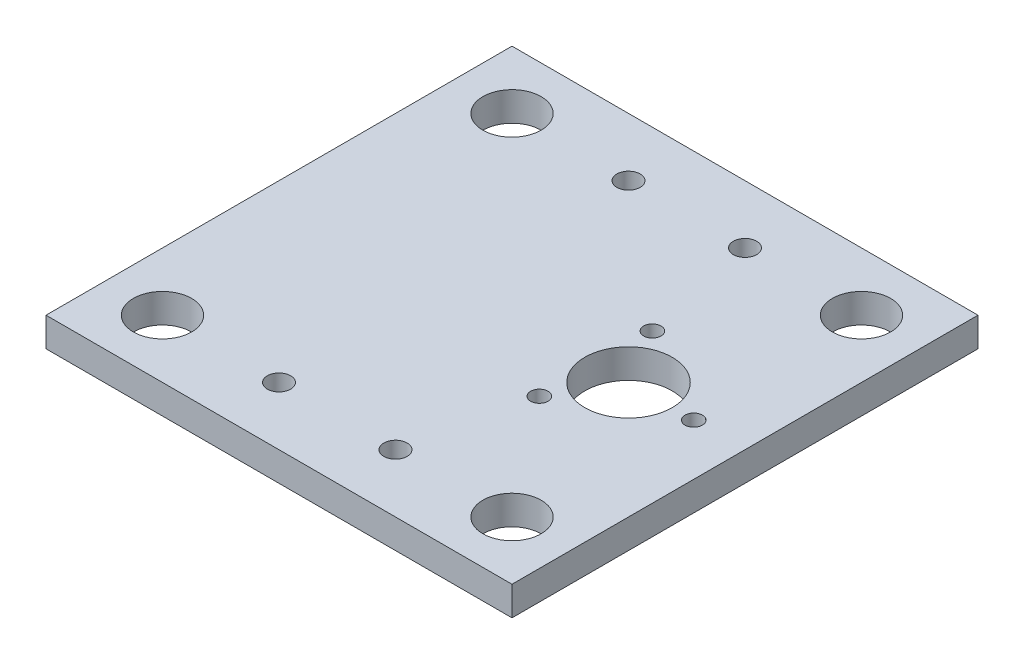
ISO-10303-21;
HEADER;
FILE_DESCRIPTION(('STEP AP214'),'2;1');
FILE_NAME('part.step','',(''),(''),'','','');
FILE_SCHEMA(('AUTOMOTIVE_DESIGN { 1 0 10303 214 1 1 1 1 }'));
ENDSEC;
DATA;
#1=APPLICATION_CONTEXT('core data for automotive mechanical design processes');
#2=APPLICATION_PROTOCOL_DEFINITION('international standard','automotive_design',2000,#1);
#3=PRODUCT_CONTEXT('',#1,'mechanical');
#4=PRODUCT('Part','Part','',(#3));
#5=PRODUCT_RELATED_PRODUCT_CATEGORY('part','',(#4));
#6=PRODUCT_DEFINITION_FORMATION('','',#4);
#7=PRODUCT_DEFINITION_CONTEXT('part definition',#1,'design');
#8=PRODUCT_DEFINITION('design','',#6,#7);
#9=PRODUCT_DEFINITION_SHAPE('','',#8);
#10=(LENGTH_UNIT() NAMED_UNIT(*) SI_UNIT(.MILLI.,.METRE.));
#11=(NAMED_UNIT(*) PLANE_ANGLE_UNIT() SI_UNIT($,.RADIAN.));
#12=(NAMED_UNIT(*) SI_UNIT($,.STERADIAN.) SOLID_ANGLE_UNIT());
#13=UNCERTAINTY_MEASURE_WITH_UNIT(LENGTH_MEASURE(1.E-05),#10,'distance_accuracy_value','');
#14=(GEOMETRIC_REPRESENTATION_CONTEXT(3) GLOBAL_UNCERTAINTY_ASSIGNED_CONTEXT((#13)) GLOBAL_UNIT_ASSIGNED_CONTEXT((#10,
#11,#12)) REPRESENTATION_CONTEXT('',''));
#15=CARTESIAN_POINT('',(0.,0.,0.));
#16=DIRECTION('',(0.,0.,1.));
#17=DIRECTION('',(1.,0.,0.));
#18=AXIS2_PLACEMENT_3D('',#15,#16,#17);
#19=CARTESIAN_POINT('',(0.,0.,0.));
#20=DIRECTION('',(0.,1.,0.));
#21=DIRECTION('',(0.,0.,1.));
#22=AXIS2_PLACEMENT_3D('',#19,#20,#21);
#23=PLANE('',#22);
#24=CARTESIAN_POINT('',(12.7,0.,-38.1));
#25=DIRECTION('',(0.,-1.,0.));
#26=DIRECTION('',(0.,0.,-1.));
#27=AXIS2_PLACEMENT_3D('',#24,#25,#26);
#28=CIRCLE('',#27,2.54);
#29=CARTESIAN_POINT('',(12.7,0.,-40.64));
#30=VERTEX_POINT('',#29);
#31=EDGE_CURVE('E113',#30,#30,#28,.F.);
#32=ORIENTED_EDGE('',*,*,#31,.T.);
#33=EDGE_LOOP('',(#32));
#34=FACE_BOUND('',#33,.T.);
#35=CARTESIAN_POINT('',(-12.7,0.,-38.1));
#36=DIRECTION('',(0.,1.,0.));
#37=DIRECTION('',(0.,0.,1.));
#38=AXIS2_PLACEMENT_3D('',#35,#36,#37);
#39=CIRCLE('',#38,2.54);
#40=CARTESIAN_POINT('',(-12.7,0.,-35.56));
#41=VERTEX_POINT('',#40);
#42=EDGE_CURVE('E117',#41,#41,#39,.T.);
#43=ORIENTED_EDGE('',*,*,#42,.T.);
#44=EDGE_LOOP('',(#43));
#45=FACE_BOUND('',#44,.T.);
#46=CARTESIAN_POINT('',(12.7,0.,38.1));
#47=DIRECTION('',(0.,1.,0.));
#48=DIRECTION('',(0.,0.,1.));
#49=AXIS2_PLACEMENT_3D('',#46,#47,#48);
#50=CIRCLE('',#49,2.54);
#51=CARTESIAN_POINT('',(12.7,0.,40.64));
#52=VERTEX_POINT('',#51);
#53=EDGE_CURVE('E120',#52,#52,#50,.T.);
#54=ORIENTED_EDGE('',*,*,#53,.T.);
#55=EDGE_LOOP('',(#54));
#56=FACE_BOUND('',#55,.T.);
#57=CARTESIAN_POINT('',(-12.7,0.,38.1));
#58=DIRECTION('',(0.,-1.,0.));
#59=DIRECTION('',(0.,0.,-1.));
#60=AXIS2_PLACEMENT_3D('',#57,#58,#59);
#61=CIRCLE('',#60,2.54);
#62=CARTESIAN_POINT('',(-12.7,0.,35.56));
#63=VERTEX_POINT('',#62);
#64=EDGE_CURVE('E123',#63,#63,#61,.F.);
#65=ORIENTED_EDGE('',*,*,#64,.T.);
#66=EDGE_LOOP('',(#65));
#67=FACE_BOUND('',#66,.T.);
#68=CARTESIAN_POINT('',(18.288,0.,12.3183453434299));
#69=DIRECTION('',(0.,1.,0.));
#70=DIRECTION('',(0.,0.,1.));
#71=AXIS2_PLACEMENT_3D('',#68,#69,#70);
#72=CIRCLE('',#71,1.89865);
#73=CARTESIAN_POINT('',(18.288,0.,14.2169953434299));
#74=VERTEX_POINT('',#73);
#75=EDGE_CURVE('E126',#74,#74,#72,.T.);
#76=ORIENTED_EDGE('',*,*,#75,.T.);
#77=EDGE_LOOP('',(#76));
#78=FACE_BOUND('',#77,.T.);
#79=CARTESIAN_POINT('',(18.288,0.,-12.3183453434299));
#80=DIRECTION('',(0.,1.,0.));
#81=DIRECTION('',(0.,0.,1.));
#82=AXIS2_PLACEMENT_3D('',#79,#80,#81);
#83=CIRCLE('',#82,1.89865);
#84=CARTESIAN_POINT('',(18.288,0.,-10.4196953434299));
#85=VERTEX_POINT('',#84);
#86=EDGE_CURVE('E129',#85,#85,#83,.T.);
#87=ORIENTED_EDGE('',*,*,#86,.T.);
#88=EDGE_LOOP('',(#87));
#89=FACE_BOUND('',#88,.T.);
#90=CARTESIAN_POINT('',(39.624,0.,0.));
#91=DIRECTION('',(0.,1.,0.));
#92=DIRECTION('',(0.,0.,1.));
#93=AXIS2_PLACEMENT_3D('',#90,#91,#92);
#94=CIRCLE('',#93,1.89865);
#95=CARTESIAN_POINT('',(39.624,0.,1.89865));
#96=VERTEX_POINT('',#95);
#97=EDGE_CURVE('E132',#96,#96,#94,.T.);
#98=ORIENTED_EDGE('',*,*,#97,.T.);
#99=EDGE_LOOP('',(#98));
#100=FACE_BOUND('',#99,.T.);
#101=CARTESIAN_POINT('',(25.4,0.,0.));
#102=DIRECTION('',(0.,1.,0.));
#103=DIRECTION('',(0.,0.,1.));
#104=AXIS2_PLACEMENT_3D('',#101,#102,#103);
#105=CIRCLE('',#104,9.525);
#106=CARTESIAN_POINT('',(25.4,0.,9.525));
#107=VERTEX_POINT('',#106);
#108=EDGE_CURVE('E135',#107,#107,#105,.T.);
#109=ORIENTED_EDGE('',*,*,#108,.T.);
#110=EDGE_LOOP('',(#109));
#111=FACE_BOUND('',#110,.T.);
#112=CARTESIAN_POINT('',(-38.1,0.,38.1));
#113=DIRECTION('',(0.,1.,0.));
#114=DIRECTION('',(0.,0.,1.));
#115=AXIS2_PLACEMENT_3D('',#112,#113,#114);
#116=CIRCLE('',#115,6.35);
#117=CARTESIAN_POINT('',(-38.1,0.,44.45));
#118=VERTEX_POINT('',#117);
#119=EDGE_CURVE('E138',#118,#118,#116,.T.);
#120=ORIENTED_EDGE('',*,*,#119,.T.);
#121=EDGE_LOOP('',(#120));
#122=FACE_BOUND('',#121,.T.);
#123=CARTESIAN_POINT('',(38.1,0.,38.1));
#124=DIRECTION('',(0.,1.,0.));
#125=DIRECTION('',(0.,0.,1.));
#126=AXIS2_PLACEMENT_3D('',#123,#124,#125);
#127=CIRCLE('',#126,6.35);
#128=CARTESIAN_POINT('',(38.1,0.,44.45));
#129=VERTEX_POINT('',#128);
#130=EDGE_CURVE('E141',#129,#129,#127,.T.);
#131=ORIENTED_EDGE('',*,*,#130,.T.);
#132=EDGE_LOOP('',(#131));
#133=FACE_BOUND('',#132,.T.);
#134=CARTESIAN_POINT('',(38.1,0.,-38.1));
#135=DIRECTION('',(0.,1.,0.));
#136=DIRECTION('',(0.,0.,1.));
#137=AXIS2_PLACEMENT_3D('',#134,#135,#136);
#138=CIRCLE('',#137,6.35);
#139=CARTESIAN_POINT('',(38.1,0.,-31.75));
#140=VERTEX_POINT('',#139);
#141=EDGE_CURVE('E143',#140,#140,#138,.T.);
#142=ORIENTED_EDGE('',*,*,#141,.T.);
#143=EDGE_LOOP('',(#142));
#144=FACE_BOUND('',#143,.T.);
#145=CARTESIAN_POINT('',(-38.1,0.,-38.1));
#146=DIRECTION('',(0.,1.,0.));
#147=DIRECTION('',(0.,0.,1.));
#148=AXIS2_PLACEMENT_3D('',#145,#146,#147);
#149=CIRCLE('',#148,6.35);
#150=CARTESIAN_POINT('',(-38.1,0.,-31.75));
#151=VERTEX_POINT('',#150);
#152=EDGE_CURVE('E19',#151,#151,#149,.T.);
#153=ORIENTED_EDGE('',*,*,#152,.T.);
#154=EDGE_LOOP('',(#153));
#155=FACE_BOUND('',#154,.T.);
#156=DIRECTION('',(0.,0.,-1.));
#157=VECTOR('',#156,1.);
#158=CARTESIAN_POINT('',(50.8,0.,50.8));
#159=LINE('',#158,#157);
#160=CARTESIAN_POINT('',(50.8,0.,50.8));
#161=VERTEX_POINT('',#160);
#162=CARTESIAN_POINT('',(50.8,0.,-50.8));
#163=VERTEX_POINT('',#162);
#164=EDGE_CURVE('E54',#161,#163,#159,.T.);
#165=ORIENTED_EDGE('',*,*,#164,.F.);
#166=DIRECTION('',(1.,0.,0.));
#167=VECTOR('',#166,1.);
#168=CARTESIAN_POINT('',(-50.8,0.,50.8));
#169=LINE('',#168,#167);
#170=CARTESIAN_POINT('',(-50.8,0.,50.8));
#171=VERTEX_POINT('',#170);
#172=EDGE_CURVE('E59',#171,#161,#169,.T.);
#173=ORIENTED_EDGE('',*,*,#172,.F.);
#174=DIRECTION('',(0.,0.,1.));
#175=VECTOR('',#174,1.);
#176=CARTESIAN_POINT('',(-50.8,0.,-50.8));
#177=LINE('',#176,#175);
#178=CARTESIAN_POINT('',(-50.8,0.,-50.8));
#179=VERTEX_POINT('',#178);
#180=EDGE_CURVE('E148',#179,#171,#177,.T.);
#181=ORIENTED_EDGE('',*,*,#180,.F.);
#182=DIRECTION('',(-1.,0.,0.));
#183=VECTOR('',#182,1.);
#184=CARTESIAN_POINT('',(50.8,0.,-50.8));
#185=LINE('',#184,#183);
#186=EDGE_CURVE('E69',#163,#179,#185,.T.);
#187=ORIENTED_EDGE('',*,*,#186,.F.);
#188=EDGE_LOOP('',(#165,#173,#181,#187));
#189=FACE_BOUND('',#188,.T.);
#190=ADVANCED_FACE('F16',(#34,#45,#56,#67,#78,#89,#100,#111,#122,#133,#144,#155,#189),#23,.F.);
#191=CARTESIAN_POINT('',(-50.8,0.,50.8));
#192=DIRECTION('',(0.,0.,1.));
#193=DIRECTION('',(1.,0.,0.));
#194=AXIS2_PLACEMENT_3D('',#191,#192,#193);
#195=PLANE('',#194);
#196=DIRECTION('',(0.,1.,0.));
#197=VECTOR('',#196,1.);
#198=CARTESIAN_POINT('',(-50.8,0.,50.8));
#199=LINE('',#198,#197);
#200=CARTESIAN_POINT('',(-50.8,6.35,50.8));
#201=VERTEX_POINT('',#200);
#202=EDGE_CURVE('E64',#171,#201,#199,.T.);
#203=ORIENTED_EDGE('',*,*,#202,.F.);
#204=ORIENTED_EDGE('',*,*,#172,.T.);
#205=DIRECTION('',(0.,1.,0.));
#206=VECTOR('',#205,1.);
#207=CARTESIAN_POINT('',(50.8,0.,50.8));
#208=LINE('',#207,#206);
#209=CARTESIAN_POINT('',(50.8,6.35,50.8));
#210=VERTEX_POINT('',#209);
#211=EDGE_CURVE('E61',#210,#161,#208,.F.);
#212=ORIENTED_EDGE('',*,*,#211,.F.);
#213=DIRECTION('',(1.,0.,0.));
#214=VECTOR('',#213,1.);
#215=CARTESIAN_POINT('',(0.,6.35,50.8));
#216=LINE('',#215,#214);
#217=EDGE_CURVE('E116',#201,#210,#216,.T.);
#218=ORIENTED_EDGE('',*,*,#217,.F.);
#219=EDGE_LOOP('',(#203,#204,#212,#218));
#220=FACE_BOUND('',#219,.T.);
#221=ADVANCED_FACE('F60',(#220),#195,.T.);
#222=CARTESIAN_POINT('',(50.8,0.,50.8));
#223=DIRECTION('',(1.,0.,0.));
#224=DIRECTION('',(0.,0.,-1.));
#225=AXIS2_PLACEMENT_3D('',#222,#223,#224);
#226=PLANE('',#225);
#227=ORIENTED_EDGE('',*,*,#211,.T.);
#228=ORIENTED_EDGE('',*,*,#164,.T.);
#229=DIRECTION('',(0.,1.,0.));
#230=VECTOR('',#229,1.);
#231=CARTESIAN_POINT('',(50.8,0.,-50.8));
#232=LINE('',#231,#230);
#233=CARTESIAN_POINT('',(50.8,6.35,-50.8));
#234=VERTEX_POINT('',#233);
#235=EDGE_CURVE('E71',#234,#163,#232,.F.);
#236=ORIENTED_EDGE('',*,*,#235,.F.);
#237=DIRECTION('',(0.,0.,1.));
#238=VECTOR('',#237,1.);
#239=CARTESIAN_POINT('',(50.8,6.35,0.));
#240=LINE('',#239,#238);
#241=EDGE_CURVE('E75',#210,#234,#240,.F.);
#242=ORIENTED_EDGE('',*,*,#241,.F.);
#243=EDGE_LOOP('',(#227,#228,#236,#242));
#244=FACE_BOUND('',#243,.T.);
#245=ADVANCED_FACE('F73',(#244),#226,.T.);
#246=CARTESIAN_POINT('',(50.8,0.,-50.8));
#247=DIRECTION('',(0.,0.,-1.));
#248=DIRECTION('',(-1.,0.,0.));
#249=AXIS2_PLACEMENT_3D('',#246,#247,#248);
#250=PLANE('',#249);
#251=ORIENTED_EDGE('',*,*,#235,.T.);
#252=ORIENTED_EDGE('',*,*,#186,.T.);
#253=DIRECTION('',(0.,1.,0.));
#254=VECTOR('',#253,1.);
#255=CARTESIAN_POINT('',(-50.8,0.,-50.8));
#256=LINE('',#255,#254);
#257=CARTESIAN_POINT('',(-50.8,6.35,-50.8));
#258=VERTEX_POINT('',#257);
#259=EDGE_CURVE('E34',#258,#179,#256,.F.);
#260=ORIENTED_EDGE('',*,*,#259,.F.);
#261=DIRECTION('',(1.,0.,0.));
#262=VECTOR('',#261,1.);
#263=CARTESIAN_POINT('',(0.,6.35,-50.8));
#264=LINE('',#263,#262);
#265=EDGE_CURVE('E160',#234,#258,#264,.F.);
#266=ORIENTED_EDGE('',*,*,#265,.F.);
#267=EDGE_LOOP('',(#251,#252,#260,#266));
#268=FACE_BOUND('',#267,.T.);
#269=ADVANCED_FACE('F158',(#268),#250,.T.);
#270=CARTESIAN_POINT('',(-50.8,0.,-50.8));
#271=DIRECTION('',(-1.,0.,0.));
#272=DIRECTION('',(0.,0.,1.));
#273=AXIS2_PLACEMENT_3D('',#270,#271,#272);
#274=PLANE('',#273);
#275=ORIENTED_EDGE('',*,*,#259,.T.);
#276=ORIENTED_EDGE('',*,*,#180,.T.);
#277=ORIENTED_EDGE('',*,*,#202,.T.);
#278=DIRECTION('',(0.,0.,1.));
#279=VECTOR('',#278,1.);
#280=CARTESIAN_POINT('',(-50.8,6.35,0.));
#281=LINE('',#280,#279);
#282=EDGE_CURVE('E112',#258,#201,#281,.T.);
#283=ORIENTED_EDGE('',*,*,#282,.F.);
#284=EDGE_LOOP('',(#275,#276,#277,#283));
#285=FACE_BOUND('',#284,.T.);
#286=ADVANCED_FACE('F166',(#285),#274,.T.);
#287=CARTESIAN_POINT('',(-38.1,0.,-38.1));
#288=DIRECTION('',(0.,1.,0.));
#289=DIRECTION('',(0.,0.,1.));
#290=AXIS2_PLACEMENT_3D('',#287,#288,#289);
#291=CYLINDRICAL_SURFACE('',#290,6.35);
#292=CARTESIAN_POINT('',(-38.1,6.35,-38.1));
#293=DIRECTION('',(0.,1.,0.));
#294=DIRECTION('',(0.,0.,1.));
#295=AXIS2_PLACEMENT_3D('',#292,#293,#294);
#296=CIRCLE('',#295,6.35);
#297=CARTESIAN_POINT('',(-38.1,6.35,-31.75));
#298=VERTEX_POINT('',#297);
#299=EDGE_CURVE('E109',#298,#298,#296,.F.);
#300=ORIENTED_EDGE('',*,*,#299,.F.);
#301=EDGE_LOOP('',(#300));
#302=FACE_BOUND('',#301,.T.);
#303=ORIENTED_EDGE('',*,*,#152,.F.);
#304=EDGE_LOOP('',(#303));
#305=FACE_BOUND('',#304,.T.);
#306=ADVANCED_FACE('F168',(#302,#305),#291,.F.);
#307=CARTESIAN_POINT('',(38.1,0.,-38.1));
#308=DIRECTION('',(0.,1.,0.));
#309=DIRECTION('',(0.,0.,1.));
#310=AXIS2_PLACEMENT_3D('',#307,#308,#309);
#311=CYLINDRICAL_SURFACE('',#310,6.35);
#312=CARTESIAN_POINT('',(38.1,6.35,-38.1));
#313=DIRECTION('',(0.,1.,0.));
#314=DIRECTION('',(0.,0.,1.));
#315=AXIS2_PLACEMENT_3D('',#312,#313,#314);
#316=CIRCLE('',#315,6.35);
#317=CARTESIAN_POINT('',(38.1,6.35,-31.75));
#318=VERTEX_POINT('',#317);
#319=EDGE_CURVE('E106',#318,#318,#316,.F.);
#320=ORIENTED_EDGE('',*,*,#319,.F.);
#321=EDGE_LOOP('',(#320));
#322=FACE_BOUND('',#321,.T.);
#323=ORIENTED_EDGE('',*,*,#141,.F.);
#324=EDGE_LOOP('',(#323));
#325=FACE_BOUND('',#324,.T.);
#326=ADVANCED_FACE('F175',(#322,#325),#311,.F.);
#327=CARTESIAN_POINT('',(38.1,0.,38.1));
#328=DIRECTION('',(0.,1.,0.));
#329=DIRECTION('',(0.,0.,1.));
#330=AXIS2_PLACEMENT_3D('',#327,#328,#329);
#331=CYLINDRICAL_SURFACE('',#330,6.35);
#332=CARTESIAN_POINT('',(38.1,6.35,38.1));
#333=DIRECTION('',(0.,1.,0.));
#334=DIRECTION('',(0.,0.,1.));
#335=AXIS2_PLACEMENT_3D('',#332,#333,#334);
#336=CIRCLE('',#335,6.35);
#337=CARTESIAN_POINT('',(38.1,6.35,44.45));
#338=VERTEX_POINT('',#337);
#339=EDGE_CURVE('E103',#338,#338,#336,.F.);
#340=ORIENTED_EDGE('',*,*,#339,.F.);
#341=EDGE_LOOP('',(#340));
#342=FACE_BOUND('',#341,.T.);
#343=ORIENTED_EDGE('',*,*,#130,.F.);
#344=EDGE_LOOP('',(#343));
#345=FACE_BOUND('',#344,.T.);
#346=ADVANCED_FACE('F221',(#342,#345),#331,.F.);
#347=CARTESIAN_POINT('',(-38.1,0.,38.1));
#348=DIRECTION('',(0.,1.,0.));
#349=DIRECTION('',(0.,0.,1.));
#350=AXIS2_PLACEMENT_3D('',#347,#348,#349);
#351=CYLINDRICAL_SURFACE('',#350,6.35);
#352=CARTESIAN_POINT('',(-38.1,6.35,38.1));
#353=DIRECTION('',(0.,1.,0.));
#354=DIRECTION('',(0.,0.,1.));
#355=AXIS2_PLACEMENT_3D('',#352,#353,#354);
#356=CIRCLE('',#355,6.35);
#357=CARTESIAN_POINT('',(-38.1,6.35,44.45));
#358=VERTEX_POINT('',#357);
#359=EDGE_CURVE('E100',#358,#358,#356,.F.);
#360=ORIENTED_EDGE('',*,*,#359,.F.);
#361=EDGE_LOOP('',(#360));
#362=FACE_BOUND('',#361,.T.);
#363=ORIENTED_EDGE('',*,*,#119,.F.);
#364=EDGE_LOOP('',(#363));
#365=FACE_BOUND('',#364,.T.);
#366=ADVANCED_FACE('F217',(#362,#365),#351,.F.);
#367=CARTESIAN_POINT('',(25.4,6.35,0.));
#368=DIRECTION('',(0.,1.,0.));
#369=DIRECTION('',(0.,0.,1.));
#370=AXIS2_PLACEMENT_3D('',#367,#368,#369);
#371=CYLINDRICAL_SURFACE('',#370,9.525);
#372=CARTESIAN_POINT('',(25.4,6.35,0.));
#373=DIRECTION('',(0.,1.,0.));
#374=DIRECTION('',(0.,0.,1.));
#375=AXIS2_PLACEMENT_3D('',#372,#373,#374);
#376=CIRCLE('',#375,9.525);
#377=CARTESIAN_POINT('',(25.4,6.35,9.525));
#378=VERTEX_POINT('',#377);
#379=EDGE_CURVE('E97',#378,#378,#376,.F.);
#380=ORIENTED_EDGE('',*,*,#379,.F.);
#381=EDGE_LOOP('',(#380));
#382=FACE_BOUND('',#381,.T.);
#383=ORIENTED_EDGE('',*,*,#108,.F.);
#384=EDGE_LOOP('',(#383));
#385=FACE_BOUND('',#384,.T.);
#386=ADVANCED_FACE('F213',(#382,#385),#371,.F.);
#387=CARTESIAN_POINT('',(39.624,-6.84936521503251,0.));
#388=DIRECTION('',(0.,1.,0.));
#389=DIRECTION('',(0.,0.,1.));
#390=AXIS2_PLACEMENT_3D('',#387,#388,#389);
#391=CYLINDRICAL_SURFACE('',#390,1.89865);
#392=CARTESIAN_POINT('',(39.624,6.35,0.));
#393=DIRECTION('',(0.,1.,0.));
#394=DIRECTION('',(0.,0.,1.));
#395=AXIS2_PLACEMENT_3D('',#392,#393,#394);
#396=CIRCLE('',#395,1.89865);
#397=CARTESIAN_POINT('',(39.624,6.35,1.89865));
#398=VERTEX_POINT('',#397);
#399=EDGE_CURVE('E94',#398,#398,#396,.F.);
#400=ORIENTED_EDGE('',*,*,#399,.F.);
#401=EDGE_LOOP('',(#400));
#402=FACE_BOUND('',#401,.T.);
#403=ORIENTED_EDGE('',*,*,#97,.F.);
#404=EDGE_LOOP('',(#403));
#405=FACE_BOUND('',#404,.T.);
#406=ADVANCED_FACE('F209',(#402,#405),#391,.F.);
#407=CARTESIAN_POINT('',(18.288,-6.84936521503251,-12.3183453434299));
#408=DIRECTION('',(0.,1.,0.));
#409=DIRECTION('',(0.,0.,1.));
#410=AXIS2_PLACEMENT_3D('',#407,#408,#409);
#411=CYLINDRICAL_SURFACE('',#410,1.89865);
#412=CARTESIAN_POINT('',(18.288,6.35,-12.3183453434299));
#413=DIRECTION('',(0.,1.,0.));
#414=DIRECTION('',(0.,0.,1.));
#415=AXIS2_PLACEMENT_3D('',#412,#413,#414);
#416=CIRCLE('',#415,1.89865);
#417=CARTESIAN_POINT('',(18.288,6.35,-10.4196953434299));
#418=VERTEX_POINT('',#417);
#419=EDGE_CURVE('E91',#418,#418,#416,.F.);
#420=ORIENTED_EDGE('',*,*,#419,.F.);
#421=EDGE_LOOP('',(#420));
#422=FACE_BOUND('',#421,.T.);
#423=ORIENTED_EDGE('',*,*,#86,.F.);
#424=EDGE_LOOP('',(#423));
#425=FACE_BOUND('',#424,.T.);
#426=ADVANCED_FACE('F205',(#422,#425),#411,.F.);
#427=CARTESIAN_POINT('',(18.288,-6.84936521503251,12.3183453434299));
#428=DIRECTION('',(0.,1.,0.));
#429=DIRECTION('',(0.,0.,1.));
#430=AXIS2_PLACEMENT_3D('',#427,#428,#429);
#431=CYLINDRICAL_SURFACE('',#430,1.89865);
#432=CARTESIAN_POINT('',(18.288,6.35,12.3183453434299));
#433=DIRECTION('',(0.,1.,0.));
#434=DIRECTION('',(0.,0.,1.));
#435=AXIS2_PLACEMENT_3D('',#432,#433,#434);
#436=CIRCLE('',#435,1.89865);
#437=CARTESIAN_POINT('',(18.288,6.35,14.2169953434299));
#438=VERTEX_POINT('',#437);
#439=EDGE_CURVE('E88',#438,#438,#436,.F.);
#440=ORIENTED_EDGE('',*,*,#439,.F.);
#441=EDGE_LOOP('',(#440));
#442=FACE_BOUND('',#441,.T.);
#443=ORIENTED_EDGE('',*,*,#75,.F.);
#444=EDGE_LOOP('',(#443));
#445=FACE_BOUND('',#444,.T.);
#446=ADVANCED_FACE('F201',(#442,#445),#431,.F.);
#447=CARTESIAN_POINT('',(-12.7,6.35,38.1));
#448=DIRECTION('',(0.,-1.,0.));
#449=DIRECTION('',(0.,0.,-1.));
#450=AXIS2_PLACEMENT_3D('',#447,#448,#449);
#451=CYLINDRICAL_SURFACE('',#450,2.54);
#452=CARTESIAN_POINT('',(-12.7,6.35,38.1));
#453=DIRECTION('',(0.,-1.,0.));
#454=DIRECTION('',(0.,0.,-1.));
#455=AXIS2_PLACEMENT_3D('',#452,#453,#454);
#456=CIRCLE('',#455,2.54);
#457=CARTESIAN_POINT('',(-12.7,6.35,35.56));
#458=VERTEX_POINT('',#457);
#459=EDGE_CURVE('E85',#458,#458,#456,.T.);
#460=ORIENTED_EDGE('',*,*,#459,.F.);
#461=EDGE_LOOP('',(#460));
#462=FACE_BOUND('',#461,.T.);
#463=ORIENTED_EDGE('',*,*,#64,.F.);
#464=EDGE_LOOP('',(#463));
#465=FACE_BOUND('',#464,.T.);
#466=ADVANCED_FACE('F197',(#462,#465),#451,.F.);
#467=CARTESIAN_POINT('',(12.7,6.35,38.1));
#468=DIRECTION('',(0.,1.,0.));
#469=DIRECTION('',(0.,0.,1.));
#470=AXIS2_PLACEMENT_3D('',#467,#468,#469);
#471=CYLINDRICAL_SURFACE('',#470,2.54);
#472=ORIENTED_EDGE('',*,*,#53,.F.);
#473=EDGE_LOOP('',(#472));
#474=FACE_BOUND('',#473,.T.);
#475=CARTESIAN_POINT('',(12.7,6.35,38.1));
#476=DIRECTION('',(0.,1.,0.));
#477=DIRECTION('',(0.,0.,1.));
#478=AXIS2_PLACEMENT_3D('',#475,#476,#477);
#479=CIRCLE('',#478,2.54);
#480=CARTESIAN_POINT('',(12.7,6.35,40.64));
#481=VERTEX_POINT('',#480);
#482=EDGE_CURVE('E82',#481,#481,#479,.F.);
#483=ORIENTED_EDGE('',*,*,#482,.F.);
#484=EDGE_LOOP('',(#483));
#485=FACE_BOUND('',#484,.T.);
#486=ADVANCED_FACE('F193',(#474,#485),#471,.F.);
#487=CARTESIAN_POINT('',(-12.7,6.35,-38.1));
#488=DIRECTION('',(0.,1.,0.));
#489=DIRECTION('',(0.,0.,1.));
#490=AXIS2_PLACEMENT_3D('',#487,#488,#489);
#491=CYLINDRICAL_SURFACE('',#490,2.54);
#492=ORIENTED_EDGE('',*,*,#42,.F.);
#493=EDGE_LOOP('',(#492));
#494=FACE_BOUND('',#493,.T.);
#495=CARTESIAN_POINT('',(-12.7,6.35,-38.1));
#496=DIRECTION('',(0.,1.,0.));
#497=DIRECTION('',(0.,0.,1.));
#498=AXIS2_PLACEMENT_3D('',#495,#496,#497);
#499=CIRCLE('',#498,2.54);
#500=CARTESIAN_POINT('',(-12.7,6.35,-35.56));
#501=VERTEX_POINT('',#500);
#502=EDGE_CURVE('E25',#501,#501,#499,.F.);
#503=ORIENTED_EDGE('',*,*,#502,.F.);
#504=EDGE_LOOP('',(#503));
#505=FACE_BOUND('',#504,.T.);
#506=ADVANCED_FACE('F186',(#494,#505),#491,.F.);
#507=CARTESIAN_POINT('',(12.7,6.35,-38.1));
#508=DIRECTION('',(0.,-1.,0.));
#509=DIRECTION('',(0.,0.,-1.));
#510=AXIS2_PLACEMENT_3D('',#507,#508,#509);
#511=CYLINDRICAL_SURFACE('',#510,2.54);
#512=CARTESIAN_POINT('',(12.7,6.35,-38.1));
#513=DIRECTION('',(0.,-1.,0.));
#514=DIRECTION('',(0.,0.,-1.));
#515=AXIS2_PLACEMENT_3D('',#512,#513,#514);
#516=CIRCLE('',#515,2.54);
#517=CARTESIAN_POINT('',(12.7,6.35,-40.64));
#518=VERTEX_POINT('',#517);
#519=EDGE_CURVE('E11',#518,#518,#516,.T.);
#520=ORIENTED_EDGE('',*,*,#519,.F.);
#521=EDGE_LOOP('',(#520));
#522=FACE_BOUND('',#521,.T.);
#523=ORIENTED_EDGE('',*,*,#31,.F.);
#524=EDGE_LOOP('',(#523));
#525=FACE_BOUND('',#524,.T.);
#526=ADVANCED_FACE('F180',(#522,#525),#511,.F.);
#527=CARTESIAN_POINT('',(0.,6.35,0.));
#528=DIRECTION('',(0.,1.,0.));
#529=DIRECTION('',(0.,0.,1.));
#530=AXIS2_PLACEMENT_3D('',#527,#528,#529);
#531=PLANE('',#530);
#532=ORIENTED_EDGE('',*,*,#519,.T.);
#533=EDGE_LOOP('',(#532));
#534=FACE_BOUND('',#533,.T.);
#535=ORIENTED_EDGE('',*,*,#502,.T.);
#536=EDGE_LOOP('',(#535));
#537=FACE_BOUND('',#536,.T.);
#538=ORIENTED_EDGE('',*,*,#482,.T.);
#539=EDGE_LOOP('',(#538));
#540=FACE_BOUND('',#539,.T.);
#541=ORIENTED_EDGE('',*,*,#459,.T.);
#542=EDGE_LOOP('',(#541));
#543=FACE_BOUND('',#542,.T.);
#544=ORIENTED_EDGE('',*,*,#439,.T.);
#545=EDGE_LOOP('',(#544));
#546=FACE_BOUND('',#545,.T.);
#547=ORIENTED_EDGE('',*,*,#419,.T.);
#548=EDGE_LOOP('',(#547));
#549=FACE_BOUND('',#548,.T.);
#550=ORIENTED_EDGE('',*,*,#399,.T.);
#551=EDGE_LOOP('',(#550));
#552=FACE_BOUND('',#551,.T.);
#553=ORIENTED_EDGE('',*,*,#379,.T.);
#554=EDGE_LOOP('',(#553));
#555=FACE_BOUND('',#554,.T.);
#556=ORIENTED_EDGE('',*,*,#359,.T.);
#557=EDGE_LOOP('',(#556));
#558=FACE_BOUND('',#557,.T.);
#559=ORIENTED_EDGE('',*,*,#339,.T.);
#560=EDGE_LOOP('',(#559));
#561=FACE_BOUND('',#560,.T.);
#562=ORIENTED_EDGE('',*,*,#319,.T.);
#563=EDGE_LOOP('',(#562));
#564=FACE_BOUND('',#563,.T.);
#565=ORIENTED_EDGE('',*,*,#299,.T.);
#566=EDGE_LOOP('',(#565));
#567=FACE_BOUND('',#566,.T.);
#568=ORIENTED_EDGE('',*,*,#265,.T.);
#569=ORIENTED_EDGE('',*,*,#282,.T.);
#570=ORIENTED_EDGE('',*,*,#217,.T.);
#571=ORIENTED_EDGE('',*,*,#241,.T.);
#572=EDGE_LOOP('',(#568,#569,#570,#571));
#573=FACE_BOUND('',#572,.T.);
#574=ADVANCED_FACE('F164',(#534,#537,#540,#543,#546,#549,#552,#555,#558,#561,#564,#567,#573),
#531,.T.);
#575=CLOSED_SHELL('',(#190,#221,#245,#269,#286,#306,#326,#346,#366,#386,#406,#426,#446,#466,
#486,#506,#526,#574));
#576=MANIFOLD_SOLID_BREP('B1',#575);
#577=ADVANCED_BREP_SHAPE_REPRESENTATION('',(#18,#576),#14);
#578=SHAPE_DEFINITION_REPRESENTATION(#9,#577);
ENDSEC;
END-ISO-10303-21;
